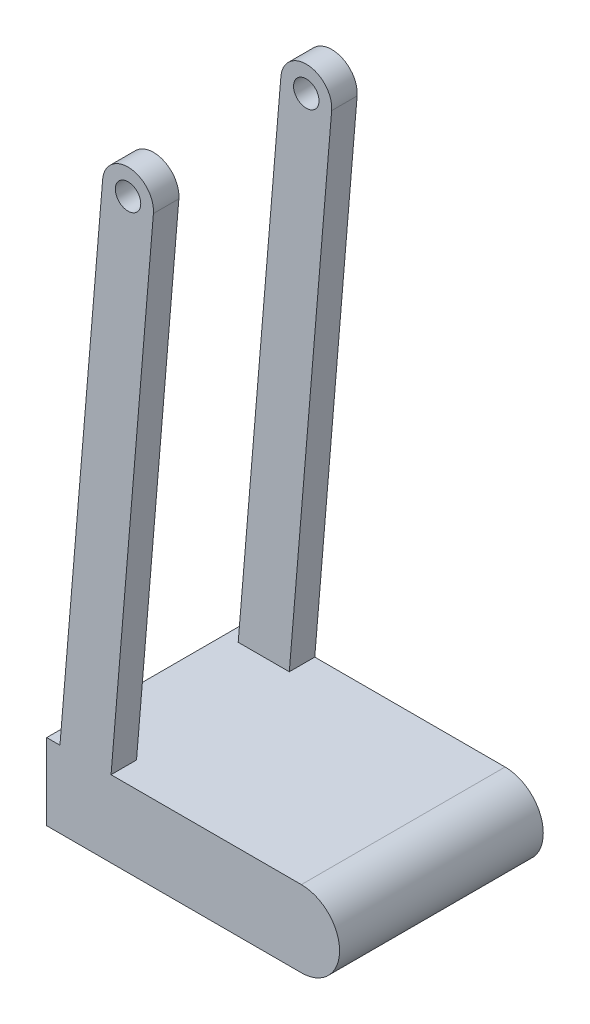
ISO-10303-21;
HEADER;
FILE_DESCRIPTION(('STEP AP214'),'2;1');
FILE_NAME('part.step','',(''),(''),'','','');
FILE_SCHEMA(('AUTOMOTIVE_DESIGN { 1 0 10303 214 1 1 1 1 }'));
ENDSEC;
DATA;
#1=APPLICATION_CONTEXT('core data for automotive mechanical design processes');
#2=APPLICATION_PROTOCOL_DEFINITION('international standard','automotive_design',2000,#1);
#3=PRODUCT_CONTEXT('',#1,'mechanical');
#4=PRODUCT('Part','Part','',(#3));
#5=PRODUCT_RELATED_PRODUCT_CATEGORY('part','',(#4));
#6=PRODUCT_DEFINITION_FORMATION('','',#4);
#7=PRODUCT_DEFINITION_CONTEXT('part definition',#1,'design');
#8=PRODUCT_DEFINITION('design','',#6,#7);
#9=PRODUCT_DEFINITION_SHAPE('','',#8);
#10=(LENGTH_UNIT() NAMED_UNIT(*) SI_UNIT(.MILLI.,.METRE.));
#11=(NAMED_UNIT(*) PLANE_ANGLE_UNIT() SI_UNIT($,.RADIAN.));
#12=(NAMED_UNIT(*) SI_UNIT($,.STERADIAN.) SOLID_ANGLE_UNIT());
#13=UNCERTAINTY_MEASURE_WITH_UNIT(LENGTH_MEASURE(1.E-05),#10,'distance_accuracy_value','');
#14=(GEOMETRIC_REPRESENTATION_CONTEXT(3) GLOBAL_UNCERTAINTY_ASSIGNED_CONTEXT((#13)) GLOBAL_UNIT_ASSIGNED_CONTEXT((#10,
#11,#12)) REPRESENTATION_CONTEXT('',''));
#15=CARTESIAN_POINT('',(0.,0.,0.));
#16=DIRECTION('',(0.,0.,1.));
#17=DIRECTION('',(1.,0.,0.));
#18=AXIS2_PLACEMENT_3D('',#15,#16,#17);
#19=CARTESIAN_POINT('',(4.18948798330065,22.9167739926822,8.));
#20=DIRECTION('',(-0.996530697824178,0.0832260073177681,0.));
#21=DIRECTION('',(-0.0832260073177681,-0.996530697824178,0.));
#22=AXIS2_PLACEMENT_3D('',#19,#20,#21);
#23=PLANE('',#22);
#24=DIRECTION('',(0.,0.,-1.));
#25=VECTOR('',#24,1.);
#26=CARTESIAN_POINT('',(4.18948798330065,22.9167739926822,8.));
#27=LINE('',#26,#25);
#28=CARTESIAN_POINT('',(4.18948798330065,22.9167739926822,1.));
#29=VERTEX_POINT('',#28);
#30=CARTESIAN_POINT('',(4.18948798330065,22.9167739926822,0.));
#31=VERTEX_POINT('',#30);
#32=EDGE_CURVE('E137',#29,#31,#27,.T.);
#33=ORIENTED_EDGE('',*,*,#32,.F.);
#34=DIRECTION('',(-0.0832260073177681,-0.996530697824178,0.));
#35=VECTOR('',#34,1.);
#36=CARTESIAN_POINT('',(4.18948798330065,22.9167739926822,1.));
#37=LINE('',#36,#35);
#38=CARTESIAN_POINT('',(2.52612369188395,3.,1.));
#39=VERTEX_POINT('',#38);
#40=EDGE_CURVE('E207',#29,#39,#37,.T.);
#41=ORIENTED_EDGE('',*,*,#40,.T.);
#42=DIRECTION('',(0.,0.,-1.));
#43=VECTOR('',#42,1.);
#44=CARTESIAN_POINT('',(2.52612369188395,3.,8.));
#45=LINE('',#44,#43);
#46=CARTESIAN_POINT('',(2.52612369188395,3.,0.));
#47=VERTEX_POINT('',#46);
#48=EDGE_CURVE('E174',#39,#47,#45,.T.);
#49=ORIENTED_EDGE('',*,*,#48,.T.);
#50=DIRECTION('',(0.0832260073177681,0.996530697824178,0.));
#51=VECTOR('',#50,1.);
#52=CARTESIAN_POINT('',(4.18948798330065,22.9167739926822,0.));
#53=LINE('',#52,#51);
#54=EDGE_CURVE('E157',#47,#31,#53,.T.);
#55=ORIENTED_EDGE('',*,*,#54,.T.);
#56=EDGE_LOOP('',(#33,#41,#49,#55));
#57=FACE_BOUND('',#56,.T.);
#58=ADVANCED_FACE('F33',(#57),#23,.F.);
#59=CARTESIAN_POINT('',(3.19295728547647,23.,8.));
#60=DIRECTION('',(0.,0.,-1.));
#61=DIRECTION('',(-1.,0.,0.));
#62=AXIS2_PLACEMENT_3D('',#59,#60,#61);
#63=CYLINDRICAL_SURFACE('',#62,1.);
#64=DIRECTION('',(0.,0.,-1.));
#65=VECTOR('',#64,1.);
#66=CARTESIAN_POINT('',(2.19642658765229,23.0832260073178,8.));
#67=LINE('',#66,#65);
#68=CARTESIAN_POINT('',(2.19642658765229,23.0832260073178,1.));
#69=VERTEX_POINT('',#68);
#70=CARTESIAN_POINT('',(2.19642658765229,23.0832260073178,0.));
#71=VERTEX_POINT('',#70);
#72=EDGE_CURVE('E138',#69,#71,#67,.T.);
#73=ORIENTED_EDGE('',*,*,#72,.F.);
#74=CARTESIAN_POINT('',(3.19295728547647,23.,1.));
#75=DIRECTION('',(0.,0.,-1.));
#76=DIRECTION('',(-1.,0.,0.));
#77=AXIS2_PLACEMENT_3D('',#74,#75,#76);
#78=CIRCLE('',#77,1.);
#79=EDGE_CURVE('E204',#69,#29,#78,.T.);
#80=ORIENTED_EDGE('',*,*,#79,.T.);
#81=ORIENTED_EDGE('',*,*,#32,.T.);
#82=CARTESIAN_POINT('',(3.19295728547647,23.,0.));
#83=DIRECTION('',(0.,0.,1.));
#84=DIRECTION('',(-1.,0.,0.));
#85=AXIS2_PLACEMENT_3D('',#82,#83,#84);
#86=CIRCLE('',#85,1.);
#87=EDGE_CURVE('E160',#31,#71,#86,.T.);
#88=ORIENTED_EDGE('',*,*,#87,.T.);
#89=EDGE_LOOP('',(#73,#80,#81,#88));
#90=FACE_BOUND('',#89,.T.);
#91=ADVANCED_FACE('F243',(#90),#63,.T.);
#92=CARTESIAN_POINT('',(0.519160931612941,3.,8.));
#93=DIRECTION('',(0.996530697824178,-0.0832260073177683,0.));
#94=DIRECTION('',(0.0832260073177683,0.996530697824178,0.));
#95=AXIS2_PLACEMENT_3D('',#92,#93,#94);
#96=PLANE('',#95);
#97=DIRECTION('',(0.,0.,-1.));
#98=VECTOR('',#97,1.);
#99=CARTESIAN_POINT('',(0.519160931612941,3.,8.));
#100=LINE('',#99,#98);
#101=CARTESIAN_POINT('',(0.519160931612941,3.,1.));
#102=VERTEX_POINT('',#101);
#103=CARTESIAN_POINT('',(0.519160931612941,3.,0.));
#104=VERTEX_POINT('',#103);
#105=EDGE_CURVE('E170',#102,#104,#100,.T.);
#106=ORIENTED_EDGE('',*,*,#105,.F.);
#107=DIRECTION('',(0.0832260073177683,0.996530697824178,0.));
#108=VECTOR('',#107,1.);
#109=CARTESIAN_POINT('',(0.519160931612941,3.,1.));
#110=LINE('',#109,#108);
#111=EDGE_CURVE('E201',#102,#69,#110,.T.);
#112=ORIENTED_EDGE('',*,*,#111,.T.);
#113=ORIENTED_EDGE('',*,*,#72,.T.);
#114=DIRECTION('',(-0.0832260073177683,-0.996530697824178,0.));
#115=VECTOR('',#114,1.);
#116=CARTESIAN_POINT('',(0.519160931612941,3.,0.));
#117=LINE('',#116,#115);
#118=EDGE_CURVE('E163',#71,#104,#117,.T.);
#119=ORIENTED_EDGE('',*,*,#118,.T.);
#120=EDGE_LOOP('',(#106,#112,#113,#119));
#121=FACE_BOUND('',#120,.T.);
#122=ADVANCED_FACE('F255',(#121),#96,.F.);
#123=CARTESIAN_POINT('',(3.19295728547647,23.,8.));
#124=DIRECTION('',(0.,0.,-1.));
#125=DIRECTION('',(-1.,0.,0.));
#126=AXIS2_PLACEMENT_3D('',#123,#124,#125);
#127=CYLINDRICAL_SURFACE('',#126,0.5);
#128=CARTESIAN_POINT('',(3.19295728547647,23.,1.));
#129=DIRECTION('',(0.,0.,-1.));
#130=DIRECTION('',(-1.,0.,0.));
#131=AXIS2_PLACEMENT_3D('',#128,#129,#130);
#132=CIRCLE('',#131,0.5);
#133=CARTESIAN_POINT('',(2.69295728547647,23.,1.));
#134=VERTEX_POINT('',#133);
#135=EDGE_CURVE('E37',#134,#134,#132,.T.);
#136=ORIENTED_EDGE('',*,*,#135,.F.);
#137=EDGE_LOOP('',(#136));
#138=FACE_BOUND('',#137,.T.);
#139=CARTESIAN_POINT('',(3.19295728547647,23.,0.));
#140=DIRECTION('',(0.,0.,1.));
#141=DIRECTION('',(1.,0.,0.));
#142=AXIS2_PLACEMENT_3D('',#139,#140,#141);
#143=CIRCLE('',#142,0.5);
#144=CARTESIAN_POINT('',(3.69295728547647,23.,0.));
#145=VERTEX_POINT('',#144);
#146=EDGE_CURVE('E210',#145,#145,#143,.T.);
#147=ORIENTED_EDGE('',*,*,#146,.F.);
#148=EDGE_LOOP('',(#147));
#149=FACE_BOUND('',#148,.T.);
#150=ADVANCED_FACE('F284',(#138,#149),#127,.F.);
#151=CARTESIAN_POINT('',(10.,1.5,8.));
#152=DIRECTION('',(0.,0.,-1.));
#153=DIRECTION('',(-1.,0.,0.));
#154=AXIS2_PLACEMENT_3D('',#151,#152,#153);
#155=PLANE('',#154);
#156=DIRECTION('',(0.,-1.,0.));
#157=VECTOR('',#156,1.);
#158=CARTESIAN_POINT('',(0.,3.,8.));
#159=LINE('',#158,#157);
#160=CARTESIAN_POINT('',(0.,3.,8.));
#161=VERTEX_POINT('',#160);
#162=CARTESIAN_POINT('',(0.,0.,8.));
#163=VERTEX_POINT('',#162);
#164=EDGE_CURVE('E168',#161,#163,#159,.T.);
#165=ORIENTED_EDGE('',*,*,#164,.T.);
#166=DIRECTION('',(1.,0.,0.));
#167=VECTOR('',#166,1.);
#168=CARTESIAN_POINT('',(10.,0.,8.));
#169=LINE('',#168,#167);
#170=CARTESIAN_POINT('',(10.,0.,8.));
#171=VERTEX_POINT('',#170);
#172=EDGE_CURVE('E99',#163,#171,#169,.T.);
#173=ORIENTED_EDGE('',*,*,#172,.T.);
#174=CARTESIAN_POINT('',(10.,1.5,8.));
#175=DIRECTION('',(0.,0.,1.));
#176=DIRECTION('',(-1.,0.,0.));
#177=AXIS2_PLACEMENT_3D('',#174,#175,#176);
#178=CIRCLE('',#177,1.5);
#179=CARTESIAN_POINT('',(10.,3.,8.));
#180=VERTEX_POINT('',#179);
#181=EDGE_CURVE('E217',#171,#180,#178,.T.);
#182=ORIENTED_EDGE('',*,*,#181,.T.);
#183=DIRECTION('',(-1.,0.,0.));
#184=VECTOR('',#183,1.);
#185=CARTESIAN_POINT('',(2.52612369188395,3.,8.));
#186=LINE('',#185,#184);
#187=CARTESIAN_POINT('',(2.52612369188395,3.,8.));
#188=VERTEX_POINT('',#187);
#189=EDGE_CURVE('E219',#180,#188,#186,.T.);
#190=ORIENTED_EDGE('',*,*,#189,.T.);
#191=DIRECTION('',(0.0832260073177681,0.996530697824178,0.));
#192=VECTOR('',#191,1.);
#193=CARTESIAN_POINT('',(4.18948798330065,22.9167739926822,8.));
#194=LINE('',#193,#192);
#195=CARTESIAN_POINT('',(4.18948798330065,22.9167739926822,8.));
#196=VERTEX_POINT('',#195);
#197=EDGE_CURVE('E122',#188,#196,#194,.T.);
#198=ORIENTED_EDGE('',*,*,#197,.T.);
#199=CARTESIAN_POINT('',(3.19295728547647,23.,8.));
#200=DIRECTION('',(0.,0.,1.));
#201=DIRECTION('',(-1.,0.,0.));
#202=AXIS2_PLACEMENT_3D('',#199,#200,#201);
#203=CIRCLE('',#202,1.);
#204=CARTESIAN_POINT('',(2.19642658765229,23.0832260073178,8.));
#205=VERTEX_POINT('',#204);
#206=EDGE_CURVE('E114',#196,#205,#203,.T.);
#207=ORIENTED_EDGE('',*,*,#206,.T.);
#208=DIRECTION('',(-0.0832260073177683,-0.996530697824178,0.));
#209=VECTOR('',#208,1.);
#210=CARTESIAN_POINT('',(0.519160931612941,3.,8.));
#211=LINE('',#210,#209);
#212=CARTESIAN_POINT('',(0.519160931612941,3.,8.));
#213=VERTEX_POINT('',#212);
#214=EDGE_CURVE('E119',#205,#213,#211,.T.);
#215=ORIENTED_EDGE('',*,*,#214,.T.);
#216=DIRECTION('',(-1.,0.,0.));
#217=VECTOR('',#216,1.);
#218=CARTESIAN_POINT('',(0.519160931612941,3.,8.));
#219=LINE('',#218,#217);
#220=EDGE_CURVE('E59',#213,#161,#219,.T.);
#221=ORIENTED_EDGE('',*,*,#220,.T.);
#222=EDGE_LOOP('',(#165,#173,#182,#190,#198,#207,#215,#221));
#223=FACE_BOUND('',#222,.T.);
#224=CARTESIAN_POINT('',(3.19295728547647,23.,8.));
#225=DIRECTION('',(0.,0.,1.));
#226=DIRECTION('',(1.,0.,0.));
#227=AXIS2_PLACEMENT_3D('',#224,#225,#226);
#228=CIRCLE('',#227,0.5);
#229=CARTESIAN_POINT('',(3.69295728547647,23.,8.));
#230=VERTEX_POINT('',#229);
#231=EDGE_CURVE('E150',#230,#230,#228,.T.);
#232=ORIENTED_EDGE('',*,*,#231,.F.);
#233=EDGE_LOOP('',(#232));
#234=FACE_BOUND('',#233,.T.);
#235=ADVANCED_FACE('F116',(#223,#234),#155,.F.);
#236=CARTESIAN_POINT('',(10.,1.5,0.));
#237=DIRECTION('',(0.,0.,-1.));
#238=DIRECTION('',(-1.,0.,0.));
#239=AXIS2_PLACEMENT_3D('',#236,#237,#238);
#240=PLANE('',#239);
#241=DIRECTION('',(0.,-1.,0.));
#242=VECTOR('',#241,1.);
#243=CARTESIAN_POINT('',(0.,3.,0.));
#244=LINE('',#243,#242);
#245=CARTESIAN_POINT('',(0.,3.,0.));
#246=VERTEX_POINT('',#245);
#247=CARTESIAN_POINT('',(0.,0.,0.));
#248=VERTEX_POINT('',#247);
#249=EDGE_CURVE('E147',#246,#248,#244,.T.);
#250=ORIENTED_EDGE('',*,*,#249,.F.);
#251=DIRECTION('',(-1.,0.,0.));
#252=VECTOR('',#251,1.);
#253=CARTESIAN_POINT('',(0.519160931612941,3.,0.));
#254=LINE('',#253,#252);
#255=EDGE_CURVE('E166',#104,#246,#254,.T.);
#256=ORIENTED_EDGE('',*,*,#255,.F.);
#257=ORIENTED_EDGE('',*,*,#118,.F.);
#258=ORIENTED_EDGE('',*,*,#87,.F.);
#259=ORIENTED_EDGE('',*,*,#54,.F.);
#260=DIRECTION('',(-1.,0.,0.));
#261=VECTOR('',#260,1.);
#262=CARTESIAN_POINT('',(2.52612369188395,3.,0.));
#263=LINE('',#262,#261);
#264=CARTESIAN_POINT('',(10.,3.,0.));
#265=VERTEX_POINT('',#264);
#266=EDGE_CURVE('E154',#265,#47,#263,.T.);
#267=ORIENTED_EDGE('',*,*,#266,.F.);
#268=CARTESIAN_POINT('',(10.,1.5,0.));
#269=DIRECTION('',(0.,0.,1.));
#270=DIRECTION('',(-1.,0.,0.));
#271=AXIS2_PLACEMENT_3D('',#268,#269,#270);
#272=CIRCLE('',#271,1.5);
#273=CARTESIAN_POINT('',(10.,0.,0.));
#274=VERTEX_POINT('',#273);
#275=EDGE_CURVE('E152',#274,#265,#272,.T.);
#276=ORIENTED_EDGE('',*,*,#275,.F.);
#277=DIRECTION('',(1.,0.,0.));
#278=VECTOR('',#277,1.);
#279=CARTESIAN_POINT('',(10.,0.,0.));
#280=LINE('',#279,#278);
#281=EDGE_CURVE('E149',#248,#274,#280,.T.);
#282=ORIENTED_EDGE('',*,*,#281,.F.);
#283=EDGE_LOOP('',(#250,#256,#257,#258,#259,#267,#276,#282));
#284=FACE_BOUND('',#283,.T.);
#285=ORIENTED_EDGE('',*,*,#146,.T.);
#286=EDGE_LOOP('',(#285));
#287=FACE_BOUND('',#286,.T.);
#288=ADVANCED_FACE('F250',(#284,#287),#240,.T.);
#289=CARTESIAN_POINT('',(0.,3.,8.));
#290=DIRECTION('',(1.,0.,0.));
#291=DIRECTION('',(0.,1.,0.));
#292=AXIS2_PLACEMENT_3D('',#289,#290,#291);
#293=PLANE('',#292);
#294=ORIENTED_EDGE('',*,*,#249,.T.);
#295=DIRECTION('',(0.,0.,-1.));
#296=VECTOR('',#295,1.);
#297=CARTESIAN_POINT('',(0.,0.,8.));
#298=LINE('',#297,#296);
#299=EDGE_CURVE('E11',#163,#248,#298,.T.);
#300=ORIENTED_EDGE('',*,*,#299,.F.);
#301=ORIENTED_EDGE('',*,*,#164,.F.);
#302=DIRECTION('',(0.,0.,-1.));
#303=VECTOR('',#302,1.);
#304=CARTESIAN_POINT('',(0.,3.,8.));
#305=LINE('',#304,#303);
#306=EDGE_CURVE('E91',#161,#246,#305,.T.);
#307=ORIENTED_EDGE('',*,*,#306,.T.);
#308=EDGE_LOOP('',(#294,#300,#301,#307));
#309=FACE_BOUND('',#308,.T.);
#310=ADVANCED_FACE('F35',(#309),#293,.F.);
#311=CARTESIAN_POINT('',(10.,0.,8.));
#312=DIRECTION('',(0.,1.,0.));
#313=DIRECTION('',(-1.,0.,0.));
#314=AXIS2_PLACEMENT_3D('',#311,#312,#313);
#315=PLANE('',#314);
#316=ORIENTED_EDGE('',*,*,#281,.T.);
#317=DIRECTION('',(0.,0.,-1.));
#318=VECTOR('',#317,1.);
#319=CARTESIAN_POINT('',(10.,0.,8.));
#320=LINE('',#319,#318);
#321=EDGE_CURVE('E42',#171,#274,#320,.T.);
#322=ORIENTED_EDGE('',*,*,#321,.F.);
#323=ORIENTED_EDGE('',*,*,#172,.F.);
#324=ORIENTED_EDGE('',*,*,#299,.T.);
#325=EDGE_LOOP('',(#316,#322,#323,#324));
#326=FACE_BOUND('',#325,.T.);
#327=ADVANCED_FACE('F258',(#326),#315,.F.);
#328=CARTESIAN_POINT('',(10.,1.5,8.));
#329=DIRECTION('',(0.,0.,-1.));
#330=DIRECTION('',(-1.,0.,0.));
#331=AXIS2_PLACEMENT_3D('',#328,#329,#330);
#332=CYLINDRICAL_SURFACE('',#331,1.5);
#333=ORIENTED_EDGE('',*,*,#275,.T.);
#334=DIRECTION('',(0.,0.,-1.));
#335=VECTOR('',#334,1.);
#336=CARTESIAN_POINT('',(10.,3.,8.));
#337=LINE('',#336,#335);
#338=EDGE_CURVE('E178',#180,#265,#337,.T.);
#339=ORIENTED_EDGE('',*,*,#338,.F.);
#340=ORIENTED_EDGE('',*,*,#181,.F.);
#341=ORIENTED_EDGE('',*,*,#321,.T.);
#342=EDGE_LOOP('',(#333,#339,#340,#341));
#343=FACE_BOUND('',#342,.T.);
#344=ADVANCED_FACE('F260',(#343),#332,.T.);
#345=CARTESIAN_POINT('',(2.52612369188395,3.,7.));
#346=VERTEX_POINT('',#345);
#347=EDGE_CURVE('E175',#188,#346,#45,.T.);
#348=ORIENTED_EDGE('',*,*,#347,.T.);
#349=DIRECTION('',(0.0832260073177681,0.996530697824178,0.));
#350=VECTOR('',#349,1.);
#351=CARTESIAN_POINT('',(4.18948798330065,22.9167739926822,7.));
#352=LINE('',#351,#350);
#353=CARTESIAN_POINT('',(4.18948798330065,22.9167739926822,7.));
#354=VERTEX_POINT('',#353);
#355=EDGE_CURVE('E198',#346,#354,#352,.T.);
#356=ORIENTED_EDGE('',*,*,#355,.T.);
#357=EDGE_CURVE('E172',#196,#354,#27,.T.);
#358=ORIENTED_EDGE('',*,*,#357,.F.);
#359=ORIENTED_EDGE('',*,*,#197,.F.);
#360=EDGE_LOOP('',(#348,#356,#358,#359));
#361=FACE_BOUND('',#360,.T.);
#362=ADVANCED_FACE('F227',(#361),#23,.F.);
#363=CARTESIAN_POINT('',(3.19295728547647,23.,7.));
#364=DIRECTION('',(0.,0.,1.));
#365=DIRECTION('',(1.,0.,0.));
#366=AXIS2_PLACEMENT_3D('',#363,#364,#365);
#367=CIRCLE('',#366,1.);
#368=CARTESIAN_POINT('',(2.19642658765229,23.0832260073178,7.));
#369=VERTEX_POINT('',#368);
#370=EDGE_CURVE('E133',#354,#369,#367,.T.);
#371=ORIENTED_EDGE('',*,*,#370,.T.);
#372=EDGE_CURVE('E129',#205,#369,#67,.T.);
#373=ORIENTED_EDGE('',*,*,#372,.F.);
#374=ORIENTED_EDGE('',*,*,#206,.F.);
#375=ORIENTED_EDGE('',*,*,#357,.T.);
#376=EDGE_LOOP('',(#371,#373,#374,#375));
#377=FACE_BOUND('',#376,.T.);
#378=ADVANCED_FACE('F130',(#377),#63,.T.);
#379=ORIENTED_EDGE('',*,*,#372,.T.);
#380=DIRECTION('',(-0.0832260073177683,-0.996530697824178,0.));
#381=VECTOR('',#380,1.);
#382=CARTESIAN_POINT('',(0.519160931612941,3.,7.));
#383=LINE('',#382,#381);
#384=CARTESIAN_POINT('',(0.519160931612942,3.,7.));
#385=VERTEX_POINT('',#384);
#386=EDGE_CURVE('E184',#369,#385,#383,.T.);
#387=ORIENTED_EDGE('',*,*,#386,.T.);
#388=EDGE_CURVE('E142',#213,#385,#100,.T.);
#389=ORIENTED_EDGE('',*,*,#388,.F.);
#390=ORIENTED_EDGE('',*,*,#214,.F.);
#391=EDGE_LOOP('',(#379,#387,#389,#390));
#392=FACE_BOUND('',#391,.T.);
#393=ADVANCED_FACE('F140',(#392),#96,.F.);
#394=CARTESIAN_POINT('',(0.519160931612941,3.,8.));
#395=DIRECTION('',(0.,-1.,0.));
#396=DIRECTION('',(0.,0.,-1.));
#397=AXIS2_PLACEMENT_3D('',#394,#395,#396);
#398=PLANE('',#397);
#399=DIRECTION('',(-1.,0.,0.));
#400=VECTOR('',#399,1.);
#401=CARTESIAN_POINT('',(7.,3.,7.));
#402=LINE('',#401,#400);
#403=EDGE_CURVE('E185',#346,#385,#402,.T.);
#404=ORIENTED_EDGE('',*,*,#403,.F.);
#405=ORIENTED_EDGE('',*,*,#347,.F.);
#406=ORIENTED_EDGE('',*,*,#189,.F.);
#407=ORIENTED_EDGE('',*,*,#338,.T.);
#408=ORIENTED_EDGE('',*,*,#266,.T.);
#409=ORIENTED_EDGE('',*,*,#48,.F.);
#410=DIRECTION('',(-1.,0.,0.));
#411=VECTOR('',#410,1.);
#412=CARTESIAN_POINT('',(7.,3.,1.));
#413=LINE('',#412,#411);
#414=EDGE_CURVE('E50',#39,#102,#413,.T.);
#415=ORIENTED_EDGE('',*,*,#414,.T.);
#416=ORIENTED_EDGE('',*,*,#105,.T.);
#417=ORIENTED_EDGE('',*,*,#255,.T.);
#418=ORIENTED_EDGE('',*,*,#306,.F.);
#419=ORIENTED_EDGE('',*,*,#220,.F.);
#420=ORIENTED_EDGE('',*,*,#388,.T.);
#421=EDGE_LOOP('',(#404,#405,#406,#407,#408,#409,#415,#416,#417,#418,#419,#420));
#422=FACE_BOUND('',#421,.T.);
#423=ADVANCED_FACE('F224',(#422),#398,.F.);
#424=CARTESIAN_POINT('',(3.19295728547647,23.,7.));
#425=DIRECTION('',(0.,0.,1.));
#426=DIRECTION('',(1.,0.,0.));
#427=AXIS2_PLACEMENT_3D('',#424,#425,#426);
#428=CIRCLE('',#427,0.5);
#429=CARTESIAN_POINT('',(3.69295728547647,23.,7.));
#430=VERTEX_POINT('',#429);
#431=EDGE_CURVE('E182',#430,#430,#428,.T.);
#432=ORIENTED_EDGE('',*,*,#431,.F.);
#433=EDGE_LOOP('',(#432));
#434=FACE_BOUND('',#433,.T.);
#435=ORIENTED_EDGE('',*,*,#231,.T.);
#436=EDGE_LOOP('',(#435));
#437=FACE_BOUND('',#436,.T.);
#438=ADVANCED_FACE('F279',(#434,#437),#127,.F.);
#439=CARTESIAN_POINT('',(7.,3.,1.));
#440=DIRECTION('',(0.,0.,-1.));
#441=DIRECTION('',(-1.,0.,0.));
#442=AXIS2_PLACEMENT_3D('',#439,#440,#441);
#443=PLANE('',#442);
#444=ORIENTED_EDGE('',*,*,#135,.T.);
#445=EDGE_LOOP('',(#444));
#446=FACE_BOUND('',#445,.T.);
#447=ORIENTED_EDGE('',*,*,#79,.F.);
#448=ORIENTED_EDGE('',*,*,#111,.F.);
#449=ORIENTED_EDGE('',*,*,#414,.F.);
#450=ORIENTED_EDGE('',*,*,#40,.F.);
#451=EDGE_LOOP('',(#447,#448,#449,#450));
#452=FACE_BOUND('',#451,.T.);
#453=ADVANCED_FACE('F238',(#446,#452),#443,.F.);
#454=CARTESIAN_POINT('',(7.,3.,7.));
#455=DIRECTION('',(0.,0.,1.));
#456=DIRECTION('',(1.,0.,0.));
#457=AXIS2_PLACEMENT_3D('',#454,#455,#456);
#458=PLANE('',#457);
#459=ORIENTED_EDGE('',*,*,#431,.T.);
#460=EDGE_LOOP('',(#459));
#461=FACE_BOUND('',#460,.T.);
#462=ORIENTED_EDGE('',*,*,#403,.T.);
#463=ORIENTED_EDGE('',*,*,#386,.F.);
#464=ORIENTED_EDGE('',*,*,#370,.F.);
#465=ORIENTED_EDGE('',*,*,#355,.F.);
#466=EDGE_LOOP('',(#462,#463,#464,#465));
#467=FACE_BOUND('',#466,.T.);
#468=ADVANCED_FACE('F290',(#461,#467),#458,.F.);
#469=CLOSED_SHELL('',(#58,#91,#122,#150,#235,#288,#310,#327,#344,#362,#378,#393,#423,#438,#453,#468));
#470=MANIFOLD_SOLID_BREP('B2',#469);
#471=ADVANCED_BREP_SHAPE_REPRESENTATION('',(#18,#470),#14);
#472=SHAPE_DEFINITION_REPRESENTATION(#9,#471);
ENDSEC;
END-ISO-10303-21;
